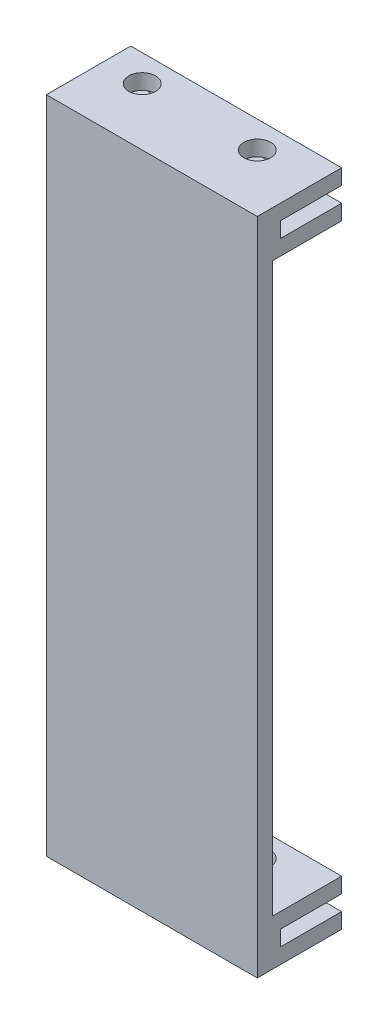
ISO-10303-21;
HEADER;
FILE_DESCRIPTION(('STEP AP214'),'2;1');
FILE_NAME('part.step','',(''),(''),'','','');
FILE_SCHEMA(('AUTOMOTIVE_DESIGN { 1 0 10303 214 1 1 1 1 }'));
ENDSEC;
DATA;
#1=APPLICATION_CONTEXT('core data for automotive mechanical design processes');
#2=APPLICATION_PROTOCOL_DEFINITION('international standard','automotive_design',2000,#1);
#3=PRODUCT_CONTEXT('',#1,'mechanical');
#4=PRODUCT('Part','Part','',(#3));
#5=PRODUCT_RELATED_PRODUCT_CATEGORY('part','',(#4));
#6=PRODUCT_DEFINITION_FORMATION('','',#4);
#7=PRODUCT_DEFINITION_CONTEXT('part definition',#1,'design');
#8=PRODUCT_DEFINITION('design','',#6,#7);
#9=PRODUCT_DEFINITION_SHAPE('','',#8);
#10=(LENGTH_UNIT() NAMED_UNIT(*) SI_UNIT(.MILLI.,.METRE.));
#11=(NAMED_UNIT(*) PLANE_ANGLE_UNIT() SI_UNIT($,.RADIAN.));
#12=(NAMED_UNIT(*) SI_UNIT($,.STERADIAN.) SOLID_ANGLE_UNIT());
#13=UNCERTAINTY_MEASURE_WITH_UNIT(LENGTH_MEASURE(1.E-05),#10,'distance_accuracy_value','');
#14=(GEOMETRIC_REPRESENTATION_CONTEXT(3) GLOBAL_UNCERTAINTY_ASSIGNED_CONTEXT((#13)) GLOBAL_UNIT_ASSIGNED_CONTEXT((#10,
#11,#12)) REPRESENTATION_CONTEXT('',''));
#15=CARTESIAN_POINT('',(0.,0.,0.));
#16=DIRECTION('',(0.,0.,1.));
#17=DIRECTION('',(1.,0.,0.));
#18=AXIS2_PLACEMENT_3D('',#15,#16,#17);
#19=CARTESIAN_POINT('',(-15.,6.,-5.5));
#20=DIRECTION('',(0.,0.,1.));
#21=DIRECTION('',(1.,0.,0.));
#22=AXIS2_PLACEMENT_3D('',#19,#20,#21);
#23=PLANE('',#22);
#24=DIRECTION('',(-1.,0.,0.));
#25=VECTOR('',#24,1.);
#26=CARTESIAN_POINT('',(-15.,80.,-5.5));
#27=LINE('',#26,#25);
#28=CARTESIAN_POINT('',(-2.,80.,-5.5));
#29=VERTEX_POINT('',#28);
#30=CARTESIAN_POINT('',(-12.5,80.,-5.5));
#31=VERTEX_POINT('',#30);
#32=EDGE_CURVE('E362',#29,#31,#27,.T.);
#33=ORIENTED_EDGE('',*,*,#32,.T.);
#34=DIRECTION('',(0.,1.,0.));
#35=VECTOR('',#34,1.);
#36=CARTESIAN_POINT('',(-12.5,86.,-5.5));
#37=LINE('',#36,#35);
#38=CARTESIAN_POINT('',(-12.5,82.,-5.5));
#39=VERTEX_POINT('',#38);
#40=EDGE_CURVE('E191',#31,#39,#37,.T.);
#41=ORIENTED_EDGE('',*,*,#40,.T.);
#42=DIRECTION('',(-1.,0.,0.));
#43=VECTOR('',#42,1.);
#44=CARTESIAN_POINT('',(-15.,82.,-5.5));
#45=LINE('',#44,#43);
#46=CARTESIAN_POINT('',(15.,82.,-5.5));
#47=VERTEX_POINT('',#46);
#48=EDGE_CURVE('E201',#47,#39,#45,.T.);
#49=ORIENTED_EDGE('',*,*,#48,.F.);
#50=DIRECTION('',(0.,1.,0.));
#51=VECTOR('',#50,1.);
#52=CARTESIAN_POINT('',(15.,80.,-5.5));
#53=LINE('',#52,#51);
#54=CARTESIAN_POINT('',(15.,80.,-5.5));
#55=VERTEX_POINT('',#54);
#56=EDGE_CURVE('E206',#55,#47,#53,.T.);
#57=ORIENTED_EDGE('',*,*,#56,.F.);
#58=CARTESIAN_POINT('',(2.,80.,-5.5));
#59=VERTEX_POINT('',#58);
#60=EDGE_CURVE('E366',#55,#59,#27,.T.);
#61=ORIENTED_EDGE('',*,*,#60,.T.);
#62=DIRECTION('',(0.,-1.,0.));
#63=VECTOR('',#62,1.);
#64=CARTESIAN_POINT('',(2.,80.,-5.5));
#65=LINE('',#64,#63);
#66=CARTESIAN_POINT('',(2.,6.,-5.5));
#67=VERTEX_POINT('',#66);
#68=EDGE_CURVE('E271',#59,#67,#65,.T.);
#69=ORIENTED_EDGE('',*,*,#68,.T.);
#70=DIRECTION('',(-1.,0.,0.));
#71=VECTOR('',#70,1.);
#72=CARTESIAN_POINT('',(-15.,6.,-5.5));
#73=LINE('',#72,#71);
#74=CARTESIAN_POINT('',(15.,6.,-5.5));
#75=VERTEX_POINT('',#74);
#76=EDGE_CURVE('E304',#75,#67,#73,.T.);
#77=ORIENTED_EDGE('',*,*,#76,.F.);
#78=DIRECTION('',(0.,-1.,0.));
#79=VECTOR('',#78,1.);
#80=CARTESIAN_POINT('',(15.,6.,-5.5));
#81=LINE('',#80,#79);
#82=CARTESIAN_POINT('',(15.,4.,-5.5));
#83=VERTEX_POINT('',#82);
#84=EDGE_CURVE('E314',#75,#83,#81,.T.);
#85=ORIENTED_EDGE('',*,*,#84,.T.);
#86=DIRECTION('',(-1.,0.,0.));
#87=VECTOR('',#86,1.);
#88=CARTESIAN_POINT('',(-15.,4.,-5.5));
#89=LINE('',#88,#87);
#90=CARTESIAN_POINT('',(-12.5,4.,-5.5));
#91=VERTEX_POINT('',#90);
#92=EDGE_CURVE('E319',#83,#91,#89,.T.);
#93=ORIENTED_EDGE('',*,*,#92,.T.);
#94=DIRECTION('',(0.,-1.,0.));
#95=VECTOR('',#94,1.);
#96=CARTESIAN_POINT('',(-12.5,0.,-5.5));
#97=LINE('',#96,#95);
#98=CARTESIAN_POINT('',(-12.5,6.,-5.5));
#99=VERTEX_POINT('',#98);
#100=EDGE_CURVE('E211',#99,#91,#97,.T.);
#101=ORIENTED_EDGE('',*,*,#100,.F.);
#102=CARTESIAN_POINT('',(-2.,6.,-5.5));
#103=VERTEX_POINT('',#102);
#104=EDGE_CURVE('E303',#103,#99,#73,.T.);
#105=ORIENTED_EDGE('',*,*,#104,.F.);
#106=DIRECTION('',(0.,-1.,0.));
#107=VECTOR('',#106,1.);
#108=CARTESIAN_POINT('',(-2.,80.,-5.5));
#109=LINE('',#108,#107);
#110=EDGE_CURVE('E264',#29,#103,#109,.T.);
#111=ORIENTED_EDGE('',*,*,#110,.F.);
#112=EDGE_LOOP('',(#33,#41,#49,#57,#61,#69,#77,#85,#93,#101,#105,#111));
#113=FACE_BOUND('',#112,.T.);
#114=ADVANCED_FACE('F37',(#113),#23,.F.);
#115=DIRECTION('',(1.,0.,0.));
#116=VECTOR('',#115,1.);
#117=CARTESIAN_POINT('',(-15.,84.,-5.5));
#118=LINE('',#117,#116);
#119=CARTESIAN_POINT('',(-12.5,84.,-5.5));
#120=VERTEX_POINT('',#119);
#121=CARTESIAN_POINT('',(15.,84.,-5.5));
#122=VERTEX_POINT('',#121);
#123=EDGE_CURVE('E363',#120,#122,#118,.T.);
#124=ORIENTED_EDGE('',*,*,#123,.F.);
#125=CARTESIAN_POINT('',(-12.5,86.,-5.5));
#126=VERTEX_POINT('',#125);
#127=EDGE_CURVE('E439',#120,#126,#37,.T.);
#128=ORIENTED_EDGE('',*,*,#127,.T.);
#129=DIRECTION('',(-1.,0.,0.));
#130=VECTOR('',#129,1.);
#131=CARTESIAN_POINT('',(-15.,86.,-5.5));
#132=LINE('',#131,#130);
#133=CARTESIAN_POINT('',(15.,86.,-5.5));
#134=VERTEX_POINT('',#133);
#135=EDGE_CURVE('E194',#134,#126,#132,.T.);
#136=ORIENTED_EDGE('',*,*,#135,.F.);
#137=EDGE_CURVE('E215',#122,#134,#53,.T.);
#138=ORIENTED_EDGE('',*,*,#137,.F.);
#139=EDGE_LOOP('',(#124,#128,#136,#138));
#140=FACE_BOUND('',#139,.T.);
#141=ADVANCED_FACE('F409',(#140),#23,.F.);
#142=CARTESIAN_POINT('',(15.,6.,-5.5));
#143=DIRECTION('',(-1.,0.,0.));
#144=DIRECTION('',(0.,0.,1.));
#145=AXIS2_PLACEMENT_3D('',#142,#143,#144);
#146=PLANE('',#145);
#147=DIRECTION('',(0.,0.,-1.));
#148=VECTOR('',#147,1.);
#149=CARTESIAN_POINT('',(15.,82.,-5.5));
#150=LINE('',#149,#148);
#151=CARTESIAN_POINT('',(15.,82.,2.5));
#152=VERTEX_POINT('',#151);
#153=EDGE_CURVE('E48',#152,#47,#150,.T.);
#154=ORIENTED_EDGE('',*,*,#153,.F.);
#155=DIRECTION('',(0.,-1.,0.));
#156=VECTOR('',#155,1.);
#157=CARTESIAN_POINT('',(15.,6.,2.5));
#158=LINE('',#157,#156);
#159=CARTESIAN_POINT('',(15.,84.,2.5));
#160=VERTEX_POINT('',#159);
#161=EDGE_CURVE('E357',#160,#152,#158,.T.);
#162=ORIENTED_EDGE('',*,*,#161,.F.);
#163=DIRECTION('',(0.,0.,1.));
#164=VECTOR('',#163,1.);
#165=CARTESIAN_POINT('',(15.,84.,-5.5));
#166=LINE('',#165,#164);
#167=EDGE_CURVE('E324',#122,#160,#166,.T.);
#168=ORIENTED_EDGE('',*,*,#167,.F.);
#169=ORIENTED_EDGE('',*,*,#137,.T.);
#170=DIRECTION('',(0.,0.,-1.));
#171=VECTOR('',#170,1.);
#172=CARTESIAN_POINT('',(15.,86.,-5.5));
#173=LINE('',#172,#171);
#174=CARTESIAN_POINT('',(15.,86.,5.5));
#175=VERTEX_POINT('',#174);
#176=EDGE_CURVE('E196',#175,#134,#173,.T.);
#177=ORIENTED_EDGE('',*,*,#176,.F.);
#178=DIRECTION('',(0.,-1.,0.));
#179=VECTOR('',#178,1.);
#180=CARTESIAN_POINT('',(15.,6.,5.5));
#181=LINE('',#180,#179);
#182=CARTESIAN_POINT('',(15.,0.,5.5));
#183=VERTEX_POINT('',#182);
#184=EDGE_CURVE('E197',#175,#183,#181,.T.);
#185=ORIENTED_EDGE('',*,*,#184,.T.);
#186=DIRECTION('',(0.,0.,-1.));
#187=VECTOR('',#186,1.);
#188=CARTESIAN_POINT('',(15.,0.,-5.5));
#189=LINE('',#188,#187);
#190=CARTESIAN_POINT('',(15.,0.,-5.5));
#191=VERTEX_POINT('',#190);
#192=EDGE_CURVE('E297',#183,#191,#189,.T.);
#193=ORIENTED_EDGE('',*,*,#192,.T.);
#194=CARTESIAN_POINT('',(15.,2.,-5.5));
#195=VERTEX_POINT('',#194);
#196=EDGE_CURVE('E313',#195,#191,#81,.T.);
#197=ORIENTED_EDGE('',*,*,#196,.F.);
#198=DIRECTION('',(0.,0.,1.));
#199=VECTOR('',#198,1.);
#200=CARTESIAN_POINT('',(15.,2.,-5.5));
#201=LINE('',#200,#199);
#202=CARTESIAN_POINT('',(15.,2.,2.5));
#203=VERTEX_POINT('',#202);
#204=EDGE_CURVE('E300',#195,#203,#201,.T.);
#205=ORIENTED_EDGE('',*,*,#204,.T.);
#206=DIRECTION('',(0.,1.,0.));
#207=VECTOR('',#206,1.);
#208=CARTESIAN_POINT('',(15.,6.,2.5));
#209=LINE('',#208,#207);
#210=CARTESIAN_POINT('',(15.,4.,2.5));
#211=VERTEX_POINT('',#210);
#212=EDGE_CURVE('E287',#203,#211,#209,.T.);
#213=ORIENTED_EDGE('',*,*,#212,.T.);
#214=DIRECTION('',(0.,0.,-1.));
#215=VECTOR('',#214,1.);
#216=CARTESIAN_POINT('',(15.,4.,-5.5));
#217=LINE('',#216,#215);
#218=EDGE_CURVE('E295',#211,#83,#217,.T.);
#219=ORIENTED_EDGE('',*,*,#218,.T.);
#220=ORIENTED_EDGE('',*,*,#84,.F.);
#221=DIRECTION('',(0.,0.,-1.));
#222=VECTOR('',#221,1.);
#223=CARTESIAN_POINT('',(15.,6.,-5.5));
#224=LINE('',#223,#222);
#225=CARTESIAN_POINT('',(15.,6.,3.5));
#226=VERTEX_POINT('',#225);
#227=EDGE_CURVE('E301',#226,#75,#224,.T.);
#228=ORIENTED_EDGE('',*,*,#227,.F.);
#229=DIRECTION('',(0.,-1.,0.));
#230=VECTOR('',#229,1.);
#231=CARTESIAN_POINT('',(15.,80.,3.5));
#232=LINE('',#231,#230);
#233=CARTESIAN_POINT('',(15.,80.,3.5));
#234=VERTEX_POINT('',#233);
#235=EDGE_CURVE('E276',#234,#226,#232,.T.);
#236=ORIENTED_EDGE('',*,*,#235,.F.);
#237=DIRECTION('',(0.,0.,-1.));
#238=VECTOR('',#237,1.);
#239=CARTESIAN_POINT('',(15.,80.,-5.5));
#240=LINE('',#239,#238);
#241=EDGE_CURVE('E205',#234,#55,#240,.T.);
#242=ORIENTED_EDGE('',*,*,#241,.T.);
#243=ORIENTED_EDGE('',*,*,#56,.T.);
#244=EDGE_LOOP('',(#154,#162,#168,#169,#177,#185,#193,#197,#205,#213,#219,#220,#228,#236,#242,#243));
#245=FACE_BOUND('',#244,.T.);
#246=ADVANCED_FACE('F45',(#245),#146,.F.);
#247=CARTESIAN_POINT('',(-12.5,2.,-5.5));
#248=VERTEX_POINT('',#247);
#249=CARTESIAN_POINT('',(-12.5,0.,-5.5));
#250=VERTEX_POINT('',#249);
#251=EDGE_CURVE('E212',#248,#250,#97,.T.);
#252=ORIENTED_EDGE('',*,*,#251,.F.);
#253=DIRECTION('',(1.,0.,0.));
#254=VECTOR('',#253,1.);
#255=CARTESIAN_POINT('',(-15.,2.,-5.5));
#256=LINE('',#255,#254);
#257=EDGE_CURVE('E322',#248,#195,#256,.T.);
#258=ORIENTED_EDGE('',*,*,#257,.T.);
#259=ORIENTED_EDGE('',*,*,#196,.T.);
#260=DIRECTION('',(-1.,0.,0.));
#261=VECTOR('',#260,1.);
#262=CARTESIAN_POINT('',(-15.,0.,-5.5));
#263=LINE('',#262,#261);
#264=EDGE_CURVE('E307',#191,#250,#263,.T.);
#265=ORIENTED_EDGE('',*,*,#264,.T.);
#266=EDGE_LOOP('',(#252,#258,#259,#265));
#267=FACE_BOUND('',#266,.T.);
#268=ADVANCED_FACE('F406',(#267),#23,.F.);
#269=CARTESIAN_POINT('',(-15.,6.,5.5));
#270=DIRECTION('',(0.,0.,-1.));
#271=DIRECTION('',(-1.,0.,0.));
#272=AXIS2_PLACEMENT_3D('',#269,#270,#271);
#273=PLANE('',#272);
#274=DIRECTION('',(1.,0.,0.));
#275=VECTOR('',#274,1.);
#276=CARTESIAN_POINT('',(-15.,86.,5.5));
#277=LINE('',#276,#275);
#278=CARTESIAN_POINT('',(-12.5,86.,5.5));
#279=VERTEX_POINT('',#278);
#280=EDGE_CURVE('E188',#279,#175,#277,.T.);
#281=ORIENTED_EDGE('',*,*,#280,.F.);
#282=DIRECTION('',(0.,1.,0.));
#283=VECTOR('',#282,1.);
#284=CARTESIAN_POINT('',(-12.5,0.,5.5));
#285=LINE('',#284,#283);
#286=CARTESIAN_POINT('',(-12.5,0.,5.5));
#287=VERTEX_POINT('',#286);
#288=EDGE_CURVE('E172',#287,#279,#285,.T.);
#289=ORIENTED_EDGE('',*,*,#288,.F.);
#290=DIRECTION('',(1.,0.,0.));
#291=VECTOR('',#290,1.);
#292=CARTESIAN_POINT('',(-15.,0.,5.5));
#293=LINE('',#292,#291);
#294=EDGE_CURVE('E302',#287,#183,#293,.T.);
#295=ORIENTED_EDGE('',*,*,#294,.T.);
#296=ORIENTED_EDGE('',*,*,#184,.F.);
#297=EDGE_LOOP('',(#281,#289,#295,#296));
#298=FACE_BOUND('',#297,.T.);
#299=ADVANCED_FACE('F198',(#298),#273,.F.);
#300=CARTESIAN_POINT('',(0.,0.,0.));
#301=DIRECTION('',(0.,1.,0.));
#302=DIRECTION('',(0.,0.,1.));
#303=AXIS2_PLACEMENT_3D('',#300,#301,#302);
#304=PLANE('',#303);
#305=CARTESIAN_POINT('',(7.5,0.,-2.));
#306=DIRECTION('',(0.,1.,0.));
#307=DIRECTION('',(0.,0.,1.));
#308=AXIS2_PLACEMENT_3D('',#305,#306,#307);
#309=CIRCLE('',#308,1.75);
#310=CARTESIAN_POINT('',(7.5,0.,-0.249999999999999));
#311=VERTEX_POINT('',#310);
#312=EDGE_CURVE('E237',#311,#311,#309,.T.);
#313=ORIENTED_EDGE('',*,*,#312,.T.);
#314=EDGE_LOOP('',(#313));
#315=FACE_BOUND('',#314,.T.);
#316=CARTESIAN_POINT('',(-7.5,0.,-2.));
#317=DIRECTION('',(0.,1.,0.));
#318=DIRECTION('',(0.,0.,1.));
#319=AXIS2_PLACEMENT_3D('',#316,#317,#318);
#320=CIRCLE('',#319,1.75);
#321=CARTESIAN_POINT('',(-7.5,0.,-0.25));
#322=VERTEX_POINT('',#321);
#323=EDGE_CURVE('E246',#322,#322,#320,.T.);
#324=ORIENTED_EDGE('',*,*,#323,.T.);
#325=EDGE_LOOP('',(#324));
#326=FACE_BOUND('',#325,.T.);
#327=DIRECTION('',(0.,0.,1.));
#328=VECTOR('',#327,1.);
#329=CARTESIAN_POINT('',(-12.5,0.,-5.5));
#330=LINE('',#329,#328);
#331=EDGE_CURVE('E179',#250,#287,#330,.T.);
#332=ORIENTED_EDGE('',*,*,#331,.F.);
#333=ORIENTED_EDGE('',*,*,#264,.F.);
#334=ORIENTED_EDGE('',*,*,#192,.F.);
#335=ORIENTED_EDGE('',*,*,#294,.F.);
#336=EDGE_LOOP('',(#332,#333,#334,#335));
#337=FACE_BOUND('',#336,.T.);
#338=ADVANCED_FACE('F421',(#315,#326,#337),#304,.F.);
#339=CARTESIAN_POINT('',(0.,6.,0.));
#340=DIRECTION('',(0.,1.,0.));
#341=DIRECTION('',(0.,0.,1.));
#342=AXIS2_PLACEMENT_3D('',#339,#340,#341);
#343=PLANE('',#342);
#344=CARTESIAN_POINT('',(7.5,6.,-2.));
#345=DIRECTION('',(0.,1.,0.));
#346=DIRECTION('',(0.,0.,-1.));
#347=AXIS2_PLACEMENT_3D('',#344,#345,#346);
#348=CIRCLE('',#347,1.75);
#349=CARTESIAN_POINT('',(7.5,6.,-3.75));
#350=VERTEX_POINT('',#349);
#351=EDGE_CURVE('E230',#350,#350,#348,.T.);
#352=ORIENTED_EDGE('',*,*,#351,.F.);
#353=EDGE_LOOP('',(#352));
#354=FACE_BOUND('',#353,.T.);
#355=DIRECTION('',(0.,0.,-1.));
#356=VECTOR('',#355,1.);
#357=CARTESIAN_POINT('',(2.,6.,-5.5));
#358=LINE('',#357,#356);
#359=CARTESIAN_POINT('',(2.,6.,3.5));
#360=VERTEX_POINT('',#359);
#361=EDGE_CURVE('E65',#360,#67,#358,.T.);
#362=ORIENTED_EDGE('',*,*,#361,.F.);
#363=DIRECTION('',(-1.,0.,0.));
#364=VECTOR('',#363,1.);
#365=CARTESIAN_POINT('',(2.,6.,3.5));
#366=LINE('',#365,#364);
#367=EDGE_CURVE('E269',#226,#360,#366,.T.);
#368=ORIENTED_EDGE('',*,*,#367,.F.);
#369=ORIENTED_EDGE('',*,*,#227,.T.);
#370=ORIENTED_EDGE('',*,*,#76,.T.);
#371=EDGE_LOOP('',(#362,#368,#369,#370));
#372=FACE_BOUND('',#371,.T.);
#373=ADVANCED_FACE('F499',(#354,#372),#343,.T.);
#374=DIRECTION('',(0.,0.,-1.));
#375=VECTOR('',#374,1.);
#376=CARTESIAN_POINT('',(-12.5,6.,0.));
#377=LINE('',#376,#375);
#378=CARTESIAN_POINT('',(-12.5,6.00000000000001,3.5));
#379=VERTEX_POINT('',#378);
#380=EDGE_CURVE('E217',#379,#99,#377,.T.);
#381=ORIENTED_EDGE('',*,*,#380,.F.);
#382=DIRECTION('',(-1.,0.,0.));
#383=VECTOR('',#382,1.);
#384=CARTESIAN_POINT('',(-2.,6.,3.5));
#385=LINE('',#384,#383);
#386=CARTESIAN_POINT('',(-2.,6.,3.5));
#387=VERTEX_POINT('',#386);
#388=EDGE_CURVE('E261',#387,#379,#385,.T.);
#389=ORIENTED_EDGE('',*,*,#388,.F.);
#390=DIRECTION('',(0.,0.,1.));
#391=VECTOR('',#390,1.);
#392=CARTESIAN_POINT('',(-2.,6.,-5.5));
#393=LINE('',#392,#391);
#394=EDGE_CURVE('E248',#103,#387,#393,.T.);
#395=ORIENTED_EDGE('',*,*,#394,.F.);
#396=ORIENTED_EDGE('',*,*,#104,.T.);
#397=EDGE_LOOP('',(#381,#389,#395,#396));
#398=FACE_BOUND('',#397,.T.);
#399=CARTESIAN_POINT('',(-7.5,6.,-2.));
#400=DIRECTION('',(0.,1.,0.));
#401=DIRECTION('',(0.,0.,1.));
#402=AXIS2_PLACEMENT_3D('',#399,#400,#401);
#403=CIRCLE('',#402,1.75);
#404=CARTESIAN_POINT('',(-7.5,6.,-0.25));
#405=VERTEX_POINT('',#404);
#406=EDGE_CURVE('E229',#405,#405,#403,.T.);
#407=ORIENTED_EDGE('',*,*,#406,.F.);
#408=EDGE_LOOP('',(#407));
#409=FACE_BOUND('',#408,.T.);
#410=ADVANCED_FACE('F475',(#398,#409),#343,.T.);
#411=CARTESIAN_POINT('',(129.,2.,-13.5));
#412=DIRECTION('',(0.,-1.,0.));
#413=DIRECTION('',(0.,0.,-1.));
#414=AXIS2_PLACEMENT_3D('',#411,#412,#413);
#415=PLANE('',#414);
#416=CARTESIAN_POINT('',(-7.5,2.,-2.));
#417=DIRECTION('',(0.,-1.,0.));
#418=DIRECTION('',(0.,0.,-1.));
#419=AXIS2_PLACEMENT_3D('',#416,#417,#418);
#420=CIRCLE('',#419,1.75);
#421=CARTESIAN_POINT('',(-7.5,2.,-3.75));
#422=VERTEX_POINT('',#421);
#423=EDGE_CURVE('E243',#422,#422,#420,.T.);
#424=ORIENTED_EDGE('',*,*,#423,.T.);
#425=EDGE_LOOP('',(#424));
#426=FACE_BOUND('',#425,.T.);
#427=CARTESIAN_POINT('',(7.5,2.,-2.));
#428=DIRECTION('',(0.,-1.,0.));
#429=DIRECTION('',(0.,0.,-1.));
#430=AXIS2_PLACEMENT_3D('',#427,#428,#429);
#431=CIRCLE('',#430,1.75);
#432=CARTESIAN_POINT('',(7.5,2.,-3.75));
#433=VERTEX_POINT('',#432);
#434=EDGE_CURVE('E236',#433,#433,#431,.T.);
#435=ORIENTED_EDGE('',*,*,#434,.T.);
#436=EDGE_LOOP('',(#435));
#437=FACE_BOUND('',#436,.T.);
#438=ORIENTED_EDGE('',*,*,#257,.F.);
#439=DIRECTION('',(0.,0.,1.));
#440=VECTOR('',#439,1.);
#441=CARTESIAN_POINT('',(-12.5,2.,-13.5));
#442=LINE('',#441,#440);
#443=CARTESIAN_POINT('',(-12.5,2.,2.5));
#444=VERTEX_POINT('',#443);
#445=EDGE_CURVE('E228',#248,#444,#442,.T.);
#446=ORIENTED_EDGE('',*,*,#445,.T.);
#447=DIRECTION('',(-1.,0.,0.));
#448=VECTOR('',#447,1.);
#449=CARTESIAN_POINT('',(129.,2.,2.5));
#450=LINE('',#449,#448);
#451=EDGE_CURVE('E286',#203,#444,#450,.T.);
#452=ORIENTED_EDGE('',*,*,#451,.F.);
#453=ORIENTED_EDGE('',*,*,#204,.F.);
#454=EDGE_LOOP('',(#438,#446,#452,#453));
#455=FACE_BOUND('',#454,.T.);
#456=ADVANCED_FACE('F431',(#426,#437,#455),#415,.F.);
#457=CARTESIAN_POINT('',(129.,4.,-13.5));
#458=DIRECTION('',(0.,1.,0.));
#459=DIRECTION('',(0.,0.,1.));
#460=AXIS2_PLACEMENT_3D('',#457,#458,#459);
#461=PLANE('',#460);
#462=CARTESIAN_POINT('',(-7.5,4.,-2.));
#463=DIRECTION('',(0.,1.,0.));
#464=DIRECTION('',(0.,0.,1.));
#465=AXIS2_PLACEMENT_3D('',#462,#463,#464);
#466=CIRCLE('',#465,1.75);
#467=CARTESIAN_POINT('',(-7.5,4.,-0.25));
#468=VERTEX_POINT('',#467);
#469=EDGE_CURVE('E245',#468,#468,#466,.T.);
#470=ORIENTED_EDGE('',*,*,#469,.T.);
#471=EDGE_LOOP('',(#470));
#472=FACE_BOUND('',#471,.T.);
#473=CARTESIAN_POINT('',(7.5,4.,-2.));
#474=DIRECTION('',(0.,1.,0.));
#475=DIRECTION('',(0.,0.,1.));
#476=AXIS2_PLACEMENT_3D('',#473,#474,#475);
#477=CIRCLE('',#476,1.75);
#478=CARTESIAN_POINT('',(7.5,4.,-0.249999999999999));
#479=VERTEX_POINT('',#478);
#480=EDGE_CURVE('E231',#479,#479,#477,.T.);
#481=ORIENTED_EDGE('',*,*,#480,.T.);
#482=EDGE_LOOP('',(#481));
#483=FACE_BOUND('',#482,.T.);
#484=DIRECTION('',(-1.,0.,0.));
#485=VECTOR('',#484,1.);
#486=CARTESIAN_POINT('',(129.,4.,2.5));
#487=LINE('',#486,#485);
#488=CARTESIAN_POINT('',(-12.5,4.,2.5));
#489=VERTEX_POINT('',#488);
#490=EDGE_CURVE('E281',#211,#489,#487,.T.);
#491=ORIENTED_EDGE('',*,*,#490,.T.);
#492=DIRECTION('',(0.,0.,-1.));
#493=VECTOR('',#492,1.);
#494=CARTESIAN_POINT('',(-12.5,4.,-13.5));
#495=LINE('',#494,#493);
#496=EDGE_CURVE('E223',#489,#91,#495,.T.);
#497=ORIENTED_EDGE('',*,*,#496,.T.);
#498=ORIENTED_EDGE('',*,*,#92,.F.);
#499=ORIENTED_EDGE('',*,*,#218,.F.);
#500=EDGE_LOOP('',(#491,#497,#498,#499));
#501=FACE_BOUND('',#500,.T.);
#502=ADVANCED_FACE('F463',(#472,#483,#501),#461,.F.);
#503=CARTESIAN_POINT('',(129.,2.,2.5));
#504=DIRECTION('',(0.,0.,1.));
#505=DIRECTION('',(1.,0.,0.));
#506=AXIS2_PLACEMENT_3D('',#503,#504,#505);
#507=PLANE('',#506);
#508=ORIENTED_EDGE('',*,*,#451,.T.);
#509=DIRECTION('',(0.,1.,0.));
#510=VECTOR('',#509,1.);
#511=CARTESIAN_POINT('',(-12.5,2.,2.5));
#512=LINE('',#511,#510);
#513=EDGE_CURVE('E216',#444,#489,#512,.T.);
#514=ORIENTED_EDGE('',*,*,#513,.T.);
#515=ORIENTED_EDGE('',*,*,#490,.F.);
#516=ORIENTED_EDGE('',*,*,#212,.F.);
#517=EDGE_LOOP('',(#508,#514,#515,#516));
#518=FACE_BOUND('',#517,.T.);
#519=ADVANCED_FACE('F470',(#518),#507,.F.);
#520=CARTESIAN_POINT('',(-2.,80.,-5.5));
#521=DIRECTION('',(1.,0.,0.));
#522=DIRECTION('',(0.,0.,-1.));
#523=AXIS2_PLACEMENT_3D('',#520,#521,#522);
#524=PLANE('',#523);
#525=ORIENTED_EDGE('',*,*,#394,.T.);
#526=DIRECTION('',(0.,-1.,0.));
#527=VECTOR('',#526,1.);
#528=CARTESIAN_POINT('',(-2.,80.,3.5));
#529=LINE('',#528,#527);
#530=CARTESIAN_POINT('',(-2.,80.,3.5));
#531=VERTEX_POINT('',#530);
#532=EDGE_CURVE('E284',#531,#387,#529,.T.);
#533=ORIENTED_EDGE('',*,*,#532,.F.);
#534=DIRECTION('',(0.,0.,1.));
#535=VECTOR('',#534,1.);
#536=CARTESIAN_POINT('',(-2.,80.,-5.5));
#537=LINE('',#536,#535);
#538=EDGE_CURVE('E249',#29,#531,#537,.T.);
#539=ORIENTED_EDGE('',*,*,#538,.F.);
#540=ORIENTED_EDGE('',*,*,#110,.T.);
#541=EDGE_LOOP('',(#525,#533,#539,#540));
#542=FACE_BOUND('',#541,.T.);
#543=ADVANCED_FACE('F478',(#542),#524,.F.);
#544=CARTESIAN_POINT('',(-2.,80.,3.5));
#545=DIRECTION('',(0.,0.,1.));
#546=DIRECTION('',(1.,0.,0.));
#547=AXIS2_PLACEMENT_3D('',#544,#545,#546);
#548=PLANE('',#547);
#549=ORIENTED_EDGE('',*,*,#388,.T.);
#550=DIRECTION('',(0.,1.,0.));
#551=VECTOR('',#550,1.);
#552=CARTESIAN_POINT('',(-12.5,80.,3.5));
#553=LINE('',#552,#551);
#554=CARTESIAN_POINT('',(-12.5,80.,3.5));
#555=VERTEX_POINT('',#554);
#556=EDGE_CURVE('E183',#379,#555,#553,.T.);
#557=ORIENTED_EDGE('',*,*,#556,.T.);
#558=DIRECTION('',(-1.,0.,0.));
#559=VECTOR('',#558,1.);
#560=CARTESIAN_POINT('',(-2.,80.,3.5));
#561=LINE('',#560,#559);
#562=EDGE_CURVE('E254',#531,#555,#561,.T.);
#563=ORIENTED_EDGE('',*,*,#562,.F.);
#564=ORIENTED_EDGE('',*,*,#532,.T.);
#565=EDGE_LOOP('',(#549,#557,#563,#564));
#566=FACE_BOUND('',#565,.T.);
#567=ADVANCED_FACE('F477',(#566),#548,.F.);
#568=CARTESIAN_POINT('',(2.,80.,3.5));
#569=DIRECTION('',(0.,0.,1.));
#570=DIRECTION('',(1.,0.,0.));
#571=AXIS2_PLACEMENT_3D('',#568,#569,#570);
#572=PLANE('',#571);
#573=ORIENTED_EDGE('',*,*,#367,.T.);
#574=DIRECTION('',(0.,-1.,0.));
#575=VECTOR('',#574,1.);
#576=CARTESIAN_POINT('',(2.,80.,3.5));
#577=LINE('',#576,#575);
#578=CARTESIAN_POINT('',(2.,80.,3.5));
#579=VERTEX_POINT('',#578);
#580=EDGE_CURVE('E277',#579,#360,#577,.T.);
#581=ORIENTED_EDGE('',*,*,#580,.F.);
#582=DIRECTION('',(-1.,0.,0.));
#583=VECTOR('',#582,1.);
#584=CARTESIAN_POINT('',(2.,80.,3.5));
#585=LINE('',#584,#583);
#586=EDGE_CURVE('E257',#234,#579,#585,.T.);
#587=ORIENTED_EDGE('',*,*,#586,.F.);
#588=ORIENTED_EDGE('',*,*,#235,.T.);
#589=EDGE_LOOP('',(#573,#581,#587,#588));
#590=FACE_BOUND('',#589,.T.);
#591=ADVANCED_FACE('F476',(#590),#572,.F.);
#592=CARTESIAN_POINT('',(2.,80.,-5.5));
#593=DIRECTION('',(-1.,0.,0.));
#594=DIRECTION('',(0.,0.,1.));
#595=AXIS2_PLACEMENT_3D('',#592,#593,#594);
#596=PLANE('',#595);
#597=ORIENTED_EDGE('',*,*,#361,.T.);
#598=ORIENTED_EDGE('',*,*,#68,.F.);
#599=DIRECTION('',(0.,0.,-1.));
#600=VECTOR('',#599,1.);
#601=CARTESIAN_POINT('',(2.,80.,-5.5));
#602=LINE('',#601,#600);
#603=EDGE_CURVE('E256',#579,#59,#602,.T.);
#604=ORIENTED_EDGE('',*,*,#603,.F.);
#605=ORIENTED_EDGE('',*,*,#580,.T.);
#606=EDGE_LOOP('',(#597,#598,#604,#605));
#607=FACE_BOUND('',#606,.T.);
#608=ADVANCED_FACE('F460',(#607),#596,.F.);
#609=CARTESIAN_POINT('',(7.5,-138.,-2.));
#610=DIRECTION('',(0.,1.,0.));
#611=DIRECTION('',(0.,0.,1.));
#612=AXIS2_PLACEMENT_3D('',#609,#610,#611);
#613=CYLINDRICAL_SURFACE('',#612,1.75);
#614=ORIENTED_EDGE('',*,*,#351,.T.);
#615=EDGE_LOOP('',(#614));
#616=FACE_BOUND('',#615,.T.);
#617=ORIENTED_EDGE('',*,*,#480,.F.);
#618=EDGE_LOOP('',(#617));
#619=FACE_BOUND('',#618,.T.);
#620=ADVANCED_FACE('F524',(#616,#619),#613,.F.);
#621=CARTESIAN_POINT('',(-7.5,-138.,-2.));
#622=DIRECTION('',(0.,1.,0.));
#623=DIRECTION('',(0.,0.,1.));
#624=AXIS2_PLACEMENT_3D('',#621,#622,#623);
#625=CYLINDRICAL_SURFACE('',#624,1.75);
#626=ORIENTED_EDGE('',*,*,#406,.T.);
#627=EDGE_LOOP('',(#626));
#628=FACE_BOUND('',#627,.T.);
#629=ORIENTED_EDGE('',*,*,#469,.F.);
#630=EDGE_LOOP('',(#629));
#631=FACE_BOUND('',#630,.T.);
#632=ADVANCED_FACE('F511',(#628,#631),#625,.F.);
#633=ORIENTED_EDGE('',*,*,#434,.F.);
#634=EDGE_LOOP('',(#633));
#635=FACE_BOUND('',#634,.T.);
#636=ORIENTED_EDGE('',*,*,#312,.F.);
#637=EDGE_LOOP('',(#636));
#638=FACE_BOUND('',#637,.T.);
#639=ADVANCED_FACE('F512',(#635,#638),#613,.F.);
#640=ORIENTED_EDGE('',*,*,#423,.F.);
#641=EDGE_LOOP('',(#640));
#642=FACE_BOUND('',#641,.T.);
#643=ORIENTED_EDGE('',*,*,#323,.F.);
#644=EDGE_LOOP('',(#643));
#645=FACE_BOUND('',#644,.T.);
#646=ADVANCED_FACE('F509',(#642,#645),#625,.F.);
#647=CARTESIAN_POINT('',(-12.5,0.,0.));
#648=DIRECTION('',(1.,0.,0.));
#649=DIRECTION('',(0.,0.,-1.));
#650=AXIS2_PLACEMENT_3D('',#647,#648,#649);
#651=PLANE('',#650);
#652=ORIENTED_EDGE('',*,*,#288,.T.);
#653=DIRECTION('',(0.,0.,1.));
#654=VECTOR('',#653,1.);
#655=CARTESIAN_POINT('',(-12.5,86.,-5.5));
#656=LINE('',#655,#654);
#657=EDGE_CURVE('E180',#126,#279,#656,.T.);
#658=ORIENTED_EDGE('',*,*,#657,.F.);
#659=ORIENTED_EDGE('',*,*,#127,.F.);
#660=DIRECTION('',(0.,0.,1.));
#661=VECTOR('',#660,1.);
#662=CARTESIAN_POINT('',(-12.5,84.,-13.5));
#663=LINE('',#662,#661);
#664=CARTESIAN_POINT('',(-12.5,84.,2.5));
#665=VERTEX_POINT('',#664);
#666=EDGE_CURVE('E53',#120,#665,#663,.T.);
#667=ORIENTED_EDGE('',*,*,#666,.T.);
#668=DIRECTION('',(0.,-1.,0.));
#669=VECTOR('',#668,1.);
#670=CARTESIAN_POINT('',(-12.5,84.,2.5));
#671=LINE('',#670,#669);
#672=CARTESIAN_POINT('',(-12.5,82.,2.5));
#673=VERTEX_POINT('',#672);
#674=EDGE_CURVE('E11',#665,#673,#671,.T.);
#675=ORIENTED_EDGE('',*,*,#674,.T.);
#676=DIRECTION('',(0.,0.,-1.));
#677=VECTOR('',#676,1.);
#678=CARTESIAN_POINT('',(-12.5,82.,-13.5));
#679=LINE('',#678,#677);
#680=EDGE_CURVE('E384',#673,#39,#679,.T.);
#681=ORIENTED_EDGE('',*,*,#680,.T.);
#682=ORIENTED_EDGE('',*,*,#40,.F.);
#683=DIRECTION('',(0.,0.,1.));
#684=VECTOR('',#683,1.);
#685=CARTESIAN_POINT('',(-12.5,80.,0.));
#686=LINE('',#685,#684);
#687=EDGE_CURVE('E382',#31,#555,#686,.T.);
#688=ORIENTED_EDGE('',*,*,#687,.T.);
#689=ORIENTED_EDGE('',*,*,#556,.F.);
#690=ORIENTED_EDGE('',*,*,#380,.T.);
#691=ORIENTED_EDGE('',*,*,#100,.T.);
#692=ORIENTED_EDGE('',*,*,#496,.F.);
#693=ORIENTED_EDGE('',*,*,#513,.F.);
#694=ORIENTED_EDGE('',*,*,#445,.F.);
#695=ORIENTED_EDGE('',*,*,#251,.T.);
#696=ORIENTED_EDGE('',*,*,#331,.T.);
#697=EDGE_LOOP('',(#652,#658,#659,#667,#675,#681,#682,#688,#689,#690,#691,#692,#693,#694,#695,#696));
#698=FACE_BOUND('',#697,.T.);
#699=ADVANCED_FACE('F176',(#698),#651,.F.);
#700=CARTESIAN_POINT('',(0.,80.,0.));
#701=DIRECTION('',(0.,-1.,0.));
#702=DIRECTION('',(0.,0.,1.));
#703=AXIS2_PLACEMENT_3D('',#700,#701,#702);
#704=PLANE('',#703);
#705=ORIENTED_EDGE('',*,*,#687,.F.);
#706=ORIENTED_EDGE('',*,*,#32,.F.);
#707=ORIENTED_EDGE('',*,*,#538,.T.);
#708=ORIENTED_EDGE('',*,*,#562,.T.);
#709=EDGE_LOOP('',(#705,#706,#707,#708));
#710=FACE_BOUND('',#709,.T.);
#711=CARTESIAN_POINT('',(-7.5,80.,-2.));
#712=DIRECTION('',(0.,1.,0.));
#713=DIRECTION('',(0.,0.,1.));
#714=AXIS2_PLACEMENT_3D('',#711,#712,#713);
#715=CIRCLE('',#714,1.75);
#716=CARTESIAN_POINT('',(-7.5,80.,-0.25));
#717=VERTEX_POINT('',#716);
#718=EDGE_CURVE('E334',#717,#717,#715,.T.);
#719=ORIENTED_EDGE('',*,*,#718,.T.);
#720=EDGE_LOOP('',(#719));
#721=FACE_BOUND('',#720,.T.);
#722=ADVANCED_FACE('F378',(#710,#721),#704,.T.);
#723=CARTESIAN_POINT('',(7.5,80.,-2.));
#724=DIRECTION('',(0.,1.,0.));
#725=DIRECTION('',(0.,0.,-1.));
#726=AXIS2_PLACEMENT_3D('',#723,#724,#725);
#727=CIRCLE('',#726,1.75);
#728=CARTESIAN_POINT('',(7.5,80.,-3.75));
#729=VERTEX_POINT('',#728);
#730=EDGE_CURVE('E385',#729,#729,#727,.T.);
#731=ORIENTED_EDGE('',*,*,#730,.T.);
#732=EDGE_LOOP('',(#731));
#733=FACE_BOUND('',#732,.T.);
#734=ORIENTED_EDGE('',*,*,#241,.F.);
#735=ORIENTED_EDGE('',*,*,#586,.T.);
#736=ORIENTED_EDGE('',*,*,#603,.T.);
#737=ORIENTED_EDGE('',*,*,#60,.F.);
#738=EDGE_LOOP('',(#734,#735,#736,#737));
#739=FACE_BOUND('',#738,.T.);
#740=ADVANCED_FACE('F453',(#733,#739),#704,.T.);
#741=CARTESIAN_POINT('',(0.,86.,0.));
#742=DIRECTION('',(0.,-1.,0.));
#743=DIRECTION('',(0.,0.,1.));
#744=AXIS2_PLACEMENT_3D('',#741,#742,#743);
#745=PLANE('',#744);
#746=CARTESIAN_POINT('',(-7.5,86.,-2.));
#747=DIRECTION('',(0.,-1.,0.));
#748=DIRECTION('',(0.,0.,-1.));
#749=AXIS2_PLACEMENT_3D('',#746,#747,#748);
#750=CIRCLE('',#749,1.75);
#751=CARTESIAN_POINT('',(-7.5,86.,-3.75));
#752=VERTEX_POINT('',#751);
#753=EDGE_CURVE('E342',#752,#752,#750,.F.);
#754=ORIENTED_EDGE('',*,*,#753,.F.);
#755=EDGE_LOOP('',(#754));
#756=FACE_BOUND('',#755,.T.);
#757=CARTESIAN_POINT('',(7.5,86.,-2.));
#758=DIRECTION('',(0.,-1.,0.));
#759=DIRECTION('',(0.,0.,-1.));
#760=AXIS2_PLACEMENT_3D('',#757,#758,#759);
#761=CIRCLE('',#760,1.75);
#762=CARTESIAN_POINT('',(7.5,86.,-3.75));
#763=VERTEX_POINT('',#762);
#764=EDGE_CURVE('E340',#763,#763,#761,.F.);
#765=ORIENTED_EDGE('',*,*,#764,.F.);
#766=EDGE_LOOP('',(#765));
#767=FACE_BOUND('',#766,.T.);
#768=ORIENTED_EDGE('',*,*,#135,.T.);
#769=ORIENTED_EDGE('',*,*,#657,.T.);
#770=ORIENTED_EDGE('',*,*,#280,.T.);
#771=ORIENTED_EDGE('',*,*,#176,.T.);
#772=EDGE_LOOP('',(#768,#769,#770,#771));
#773=FACE_BOUND('',#772,.T.);
#774=ADVANCED_FACE('F189',(#756,#767,#773),#745,.F.);
#775=CARTESIAN_POINT('',(129.,82.,-13.5));
#776=DIRECTION('',(0.,1.,0.));
#777=DIRECTION('',(0.,0.,1.));
#778=AXIS2_PLACEMENT_3D('',#775,#776,#777);
#779=PLANE('',#778);
#780=ORIENTED_EDGE('',*,*,#680,.F.);
#781=DIRECTION('',(-1.,0.,0.));
#782=VECTOR('',#781,1.);
#783=CARTESIAN_POINT('',(129.,82.,2.5));
#784=LINE('',#783,#782);
#785=EDGE_CURVE('E352',#152,#673,#784,.T.);
#786=ORIENTED_EDGE('',*,*,#785,.F.);
#787=ORIENTED_EDGE('',*,*,#153,.T.);
#788=ORIENTED_EDGE('',*,*,#48,.T.);
#789=EDGE_LOOP('',(#780,#786,#787,#788));
#790=FACE_BOUND('',#789,.T.);
#791=CARTESIAN_POINT('',(-7.5,82.,-2.));
#792=DIRECTION('',(0.,1.,0.));
#793=DIRECTION('',(0.,0.,1.));
#794=AXIS2_PLACEMENT_3D('',#791,#792,#793);
#795=CIRCLE('',#794,1.75);
#796=CARTESIAN_POINT('',(-7.5,82.,-0.25));
#797=VERTEX_POINT('',#796);
#798=EDGE_CURVE('E337',#797,#797,#795,.F.);
#799=ORIENTED_EDGE('',*,*,#798,.T.);
#800=EDGE_LOOP('',(#799));
#801=FACE_BOUND('',#800,.T.);
#802=CARTESIAN_POINT('',(7.5,82.,-2.));
#803=DIRECTION('',(0.,1.,0.));
#804=DIRECTION('',(0.,0.,1.));
#805=AXIS2_PLACEMENT_3D('',#802,#803,#804);
#806=CIRCLE('',#805,1.75);
#807=CARTESIAN_POINT('',(7.5,82.,-0.249999999999999));
#808=VERTEX_POINT('',#807);
#809=EDGE_CURVE('E335',#808,#808,#806,.F.);
#810=ORIENTED_EDGE('',*,*,#809,.T.);
#811=EDGE_LOOP('',(#810));
#812=FACE_BOUND('',#811,.T.);
#813=ADVANCED_FACE('F452',(#790,#801,#812),#779,.T.);
#814=CARTESIAN_POINT('',(129.,84.,-13.5));
#815=DIRECTION('',(0.,-1.,0.));
#816=DIRECTION('',(0.,0.,-1.));
#817=AXIS2_PLACEMENT_3D('',#814,#815,#816);
#818=PLANE('',#817);
#819=ORIENTED_EDGE('',*,*,#666,.F.);
#820=ORIENTED_EDGE('',*,*,#123,.T.);
#821=ORIENTED_EDGE('',*,*,#167,.T.);
#822=DIRECTION('',(-1.,0.,0.));
#823=VECTOR('',#822,1.);
#824=CARTESIAN_POINT('',(129.,84.,2.5));
#825=LINE('',#824,#823);
#826=EDGE_CURVE('E353',#160,#665,#825,.T.);
#827=ORIENTED_EDGE('',*,*,#826,.T.);
#828=EDGE_LOOP('',(#819,#820,#821,#827));
#829=FACE_BOUND('',#828,.T.);
#830=CARTESIAN_POINT('',(-7.5,84.,-2.));
#831=DIRECTION('',(0.,-1.,0.));
#832=DIRECTION('',(0.,0.,-1.));
#833=AXIS2_PLACEMENT_3D('',#830,#831,#832);
#834=CIRCLE('',#833,1.75);
#835=CARTESIAN_POINT('',(-7.5,84.,-3.75));
#836=VERTEX_POINT('',#835);
#837=EDGE_CURVE('E331',#836,#836,#834,.F.);
#838=ORIENTED_EDGE('',*,*,#837,.T.);
#839=EDGE_LOOP('',(#838));
#840=FACE_BOUND('',#839,.T.);
#841=CARTESIAN_POINT('',(7.5,84.,-2.));
#842=DIRECTION('',(0.,-1.,0.));
#843=DIRECTION('',(0.,0.,-1.));
#844=AXIS2_PLACEMENT_3D('',#841,#842,#843);
#845=CIRCLE('',#844,1.75);
#846=CARTESIAN_POINT('',(7.5,84.,-3.75));
#847=VERTEX_POINT('',#846);
#848=EDGE_CURVE('E326',#847,#847,#845,.F.);
#849=ORIENTED_EDGE('',*,*,#848,.T.);
#850=EDGE_LOOP('',(#849));
#851=FACE_BOUND('',#850,.T.);
#852=ADVANCED_FACE('F442',(#829,#840,#851),#818,.T.);
#853=CARTESIAN_POINT('',(129.,84.,2.5));
#854=DIRECTION('',(0.,0.,-1.));
#855=DIRECTION('',(-1.,0.,0.));
#856=AXIS2_PLACEMENT_3D('',#853,#854,#855);
#857=PLANE('',#856);
#858=ORIENTED_EDGE('',*,*,#674,.F.);
#859=ORIENTED_EDGE('',*,*,#826,.F.);
#860=ORIENTED_EDGE('',*,*,#161,.T.);
#861=ORIENTED_EDGE('',*,*,#785,.T.);
#862=EDGE_LOOP('',(#858,#859,#860,#861));
#863=FACE_BOUND('',#862,.T.);
#864=ADVANCED_FACE('F450',(#863),#857,.T.);
#865=CARTESIAN_POINT('',(7.5,224.,-2.));
#866=DIRECTION('',(0.,-1.,0.));
#867=DIRECTION('',(0.,0.,-1.));
#868=AXIS2_PLACEMENT_3D('',#865,#866,#867);
#869=CYLINDRICAL_SURFACE('',#868,1.75);
#870=ORIENTED_EDGE('',*,*,#848,.F.);
#871=EDGE_LOOP('',(#870));
#872=FACE_BOUND('',#871,.T.);
#873=ORIENTED_EDGE('',*,*,#764,.T.);
#874=EDGE_LOOP('',(#873));
#875=FACE_BOUND('',#874,.T.);
#876=ADVANCED_FACE('F401',(#872,#875),#869,.F.);
#877=CARTESIAN_POINT('',(-7.5,224.,-2.));
#878=DIRECTION('',(0.,-1.,0.));
#879=DIRECTION('',(0.,0.,-1.));
#880=AXIS2_PLACEMENT_3D('',#877,#878,#879);
#881=CYLINDRICAL_SURFACE('',#880,1.75);
#882=ORIENTED_EDGE('',*,*,#837,.F.);
#883=EDGE_LOOP('',(#882));
#884=FACE_BOUND('',#883,.T.);
#885=ORIENTED_EDGE('',*,*,#753,.T.);
#886=EDGE_LOOP('',(#885));
#887=FACE_BOUND('',#886,.T.);
#888=ADVANCED_FACE('F400',(#884,#887),#881,.F.);
#889=ORIENTED_EDGE('',*,*,#809,.F.);
#890=EDGE_LOOP('',(#889));
#891=FACE_BOUND('',#890,.T.);
#892=ORIENTED_EDGE('',*,*,#730,.F.);
#893=EDGE_LOOP('',(#892));
#894=FACE_BOUND('',#893,.T.);
#895=ADVANCED_FACE('F395',(#891,#894),#869,.F.);
#896=ORIENTED_EDGE('',*,*,#798,.F.);
#897=EDGE_LOOP('',(#896));
#898=FACE_BOUND('',#897,.T.);
#899=ORIENTED_EDGE('',*,*,#718,.F.);
#900=EDGE_LOOP('',(#899));
#901=FACE_BOUND('',#900,.T.);
#902=ADVANCED_FACE('F394',(#898,#901),#881,.F.);
#903=CLOSED_SHELL('',(#114,#141,#246,#268,#299,#338,#373,#410,#456,#502,#519,#543,#567,#591,
#608,#620,#632,#639,#646,#699,#722,#740,#774,#813,#852,#864,#876,#888,#895,#902));
#904=MANIFOLD_SOLID_BREP('B2',#903);
#905=ADVANCED_BREP_SHAPE_REPRESENTATION('',(#18,#904),#14);
#906=SHAPE_DEFINITION_REPRESENTATION(#9,#905);
ENDSEC;
END-ISO-10303-21;
